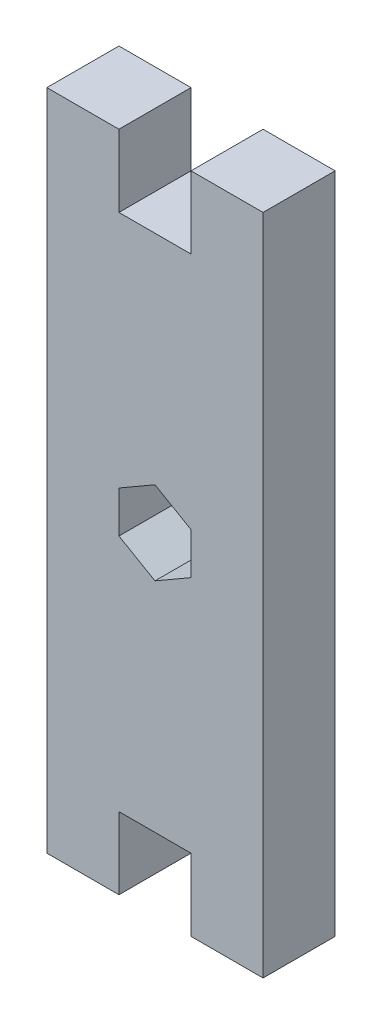
ISO-10303-21;
HEADER;
FILE_DESCRIPTION(('STEP AP214'),'2;1');
FILE_NAME('part.step','',(''),(''),'','','');
FILE_SCHEMA(('AUTOMOTIVE_DESIGN { 1 0 10303 214 1 1 1 1 }'));
ENDSEC;
DATA;
#1=APPLICATION_CONTEXT('core data for automotive mechanical design processes');
#2=APPLICATION_PROTOCOL_DEFINITION('international standard','automotive_design',2000,#1);
#3=PRODUCT_CONTEXT('',#1,'mechanical');
#4=PRODUCT('Part','Part','',(#3));
#5=PRODUCT_RELATED_PRODUCT_CATEGORY('part','',(#4));
#6=PRODUCT_DEFINITION_FORMATION('','',#4);
#7=PRODUCT_DEFINITION_CONTEXT('part definition',#1,'design');
#8=PRODUCT_DEFINITION('design','',#6,#7);
#9=PRODUCT_DEFINITION_SHAPE('','',#8);
#10=(LENGTH_UNIT() NAMED_UNIT(*) SI_UNIT(.MILLI.,.METRE.));
#11=(NAMED_UNIT(*) PLANE_ANGLE_UNIT() SI_UNIT($,.RADIAN.));
#12=(NAMED_UNIT(*) SI_UNIT($,.STERADIAN.) SOLID_ANGLE_UNIT());
#13=UNCERTAINTY_MEASURE_WITH_UNIT(LENGTH_MEASURE(1.E-05),#10,'distance_accuracy_value','');
#14=(GEOMETRIC_REPRESENTATION_CONTEXT(3) GLOBAL_UNCERTAINTY_ASSIGNED_CONTEXT((#13)) GLOBAL_UNIT_ASSIGNED_CONTEXT((#10,
#11,#12)) REPRESENTATION_CONTEXT('',''));
#15=CARTESIAN_POINT('',(0.,0.,0.));
#16=DIRECTION('',(0.,0.,1.));
#17=DIRECTION('',(1.,0.,0.));
#18=AXIS2_PLACEMENT_3D('',#15,#16,#17);
#19=CARTESIAN_POINT('',(-6.53192263334565,2.92543021032505,5.));
#20=DIRECTION('',(1.,0.,0.));
#21=DIRECTION('',(0.,1.,0.));
#22=AXIS2_PLACEMENT_3D('',#19,#20,#21);
#23=PLANE('',#22);
#24=DIRECTION('',(0.,-1.,0.));
#25=VECTOR('',#24,1.);
#26=CARTESIAN_POINT('',(-6.53192263334565,2.92543021032505,0.));
#27=LINE('',#26,#25);
#28=CARTESIAN_POINT('',(-6.53192263334565,2.92543021032505,0.));
#29=VERTEX_POINT('',#28);
#30=CARTESIAN_POINT('',(-6.53192263334564,-43.074569789675,0.));
#31=VERTEX_POINT('',#30);
#32=EDGE_CURVE('E208',#29,#31,#27,.T.);
#33=ORIENTED_EDGE('',*,*,#32,.T.);
#34=DIRECTION('',(0.,0.,-1.));
#35=VECTOR('',#34,1.);
#36=CARTESIAN_POINT('',(-6.53192263334564,-43.074569789675,5.));
#37=LINE('',#36,#35);
#38=CARTESIAN_POINT('',(-6.53192263334564,-43.074569789675,5.));
#39=VERTEX_POINT('',#38);
#40=EDGE_CURVE('E11',#39,#31,#37,.T.);
#41=ORIENTED_EDGE('',*,*,#40,.F.);
#42=DIRECTION('',(0.,-1.,0.));
#43=VECTOR('',#42,1.);
#44=CARTESIAN_POINT('',(-6.53192263334565,2.92543021032505,5.));
#45=LINE('',#44,#43);
#46=CARTESIAN_POINT('',(-6.53192263334565,2.92543021032505,5.));
#47=VERTEX_POINT('',#46);
#48=EDGE_CURVE('E209',#47,#39,#45,.T.);
#49=ORIENTED_EDGE('',*,*,#48,.F.);
#50=DIRECTION('',(0.,0.,-1.));
#51=VECTOR('',#50,1.);
#52=CARTESIAN_POINT('',(-6.53192263334565,2.92543021032505,5.));
#53=LINE('',#52,#51);
#54=EDGE_CURVE('E235',#47,#29,#53,.T.);
#55=ORIENTED_EDGE('',*,*,#54,.T.);
#56=EDGE_LOOP('',(#33,#41,#49,#55));
#57=FACE_BOUND('',#56,.T.);
#58=ADVANCED_FACE('F34',(#57),#23,.F.);
#59=CARTESIAN_POINT('',(-6.53192263334564,-43.074569789675,5.));
#60=DIRECTION('',(0.,1.,0.));
#61=DIRECTION('',(0.,0.,1.));
#62=AXIS2_PLACEMENT_3D('',#59,#60,#61);
#63=PLANE('',#62);
#64=DIRECTION('',(1.,0.,0.));
#65=VECTOR('',#64,1.);
#66=CARTESIAN_POINT('',(-6.53192263334564,-43.074569789675,0.));
#67=LINE('',#66,#65);
#68=CARTESIAN_POINT('',(-1.53192263334564,-43.074569789675,0.));
#69=VERTEX_POINT('',#68);
#70=EDGE_CURVE('E238',#31,#69,#67,.T.);
#71=ORIENTED_EDGE('',*,*,#70,.T.);
#72=DIRECTION('',(0.,0.,-1.));
#73=VECTOR('',#72,1.);
#74=CARTESIAN_POINT('',(-1.53192263334564,-43.074569789675,5.));
#75=LINE('',#74,#73);
#76=CARTESIAN_POINT('',(-1.53192263334564,-43.074569789675,5.));
#77=VERTEX_POINT('',#76);
#78=EDGE_CURVE('E41',#77,#69,#75,.T.);
#79=ORIENTED_EDGE('',*,*,#78,.F.);
#80=DIRECTION('',(1.,0.,0.));
#81=VECTOR('',#80,1.);
#82=CARTESIAN_POINT('',(-6.53192263334564,-43.074569789675,5.));
#83=LINE('',#82,#81);
#84=EDGE_CURVE('E212',#39,#77,#83,.T.);
#85=ORIENTED_EDGE('',*,*,#84,.F.);
#86=ORIENTED_EDGE('',*,*,#40,.T.);
#87=EDGE_LOOP('',(#71,#79,#85,#86));
#88=FACE_BOUND('',#87,.T.);
#89=ADVANCED_FACE('F313',(#88),#63,.F.);
#90=CARTESIAN_POINT('',(-1.53192263334564,-43.074569789675,5.));
#91=DIRECTION('',(-1.,0.,0.));
#92=DIRECTION('',(0.,-1.,0.));
#93=AXIS2_PLACEMENT_3D('',#90,#91,#92);
#94=PLANE('',#93);
#95=DIRECTION('',(0.,1.,0.));
#96=VECTOR('',#95,1.);
#97=CARTESIAN_POINT('',(-1.53192263334564,-43.074569789675,0.));
#98=LINE('',#97,#96);
#99=CARTESIAN_POINT('',(-1.53192263334565,-38.0745697896749,0.));
#100=VERTEX_POINT('',#99);
#101=EDGE_CURVE('E240',#69,#100,#98,.T.);
#102=ORIENTED_EDGE('',*,*,#101,.T.);
#103=DIRECTION('',(0.,0.,-1.));
#104=VECTOR('',#103,1.);
#105=CARTESIAN_POINT('',(-1.53192263334565,-38.0745697896749,5.));
#106=LINE('',#105,#104);
#107=CARTESIAN_POINT('',(-1.53192263334565,-38.0745697896749,5.));
#108=VERTEX_POINT('',#107);
#109=EDGE_CURVE('E285',#108,#100,#106,.T.);
#110=ORIENTED_EDGE('',*,*,#109,.F.);
#111=DIRECTION('',(0.,1.,0.));
#112=VECTOR('',#111,1.);
#113=CARTESIAN_POINT('',(-1.53192263334564,-43.074569789675,5.));
#114=LINE('',#113,#112);
#115=EDGE_CURVE('E215',#77,#108,#114,.T.);
#116=ORIENTED_EDGE('',*,*,#115,.F.);
#117=ORIENTED_EDGE('',*,*,#78,.T.);
#118=EDGE_LOOP('',(#102,#110,#116,#117));
#119=FACE_BOUND('',#118,.T.);
#120=ADVANCED_FACE('F292',(#119),#94,.F.);
#121=CARTESIAN_POINT('',(-1.53192263334565,-38.0745697896749,5.));
#122=DIRECTION('',(0.,1.,0.));
#123=DIRECTION('',(0.,0.,1.));
#124=AXIS2_PLACEMENT_3D('',#121,#122,#123);
#125=PLANE('',#124);
#126=DIRECTION('',(1.,0.,0.));
#127=VECTOR('',#126,1.);
#128=CARTESIAN_POINT('',(-1.53192263334565,-38.0745697896749,0.));
#129=LINE('',#128,#127);
#130=CARTESIAN_POINT('',(3.46807736665436,-38.0745697896749,0.));
#131=VERTEX_POINT('',#130);
#132=EDGE_CURVE('E242',#100,#131,#129,.T.);
#133=ORIENTED_EDGE('',*,*,#132,.T.);
#134=DIRECTION('',(0.,0.,-1.));
#135=VECTOR('',#134,1.);
#136=CARTESIAN_POINT('',(3.46807736665436,-38.0745697896749,5.));
#137=LINE('',#136,#135);
#138=CARTESIAN_POINT('',(3.46807736665436,-38.0745697896749,5.));
#139=VERTEX_POINT('',#138);
#140=EDGE_CURVE('E282',#139,#131,#137,.T.);
#141=ORIENTED_EDGE('',*,*,#140,.F.);
#142=DIRECTION('',(1.,0.,0.));
#143=VECTOR('',#142,1.);
#144=CARTESIAN_POINT('',(-1.53192263334565,-38.0745697896749,5.));
#145=LINE('',#144,#143);
#146=EDGE_CURVE('E217',#108,#139,#145,.T.);
#147=ORIENTED_EDGE('',*,*,#146,.F.);
#148=ORIENTED_EDGE('',*,*,#109,.T.);
#149=EDGE_LOOP('',(#133,#141,#147,#148));
#150=FACE_BOUND('',#149,.T.);
#151=ADVANCED_FACE('F301',(#150),#125,.F.);
#152=CARTESIAN_POINT('',(3.46807736665435,-43.074569789675,5.));
#153=DIRECTION('',(1.,0.,0.));
#154=DIRECTION('',(0.,1.,0.));
#155=AXIS2_PLACEMENT_3D('',#152,#153,#154);
#156=PLANE('',#155);
#157=DIRECTION('',(0.,-1.,0.));
#158=VECTOR('',#157,1.);
#159=CARTESIAN_POINT('',(3.46807736665435,-43.074569789675,0.));
#160=LINE('',#159,#158);
#161=CARTESIAN_POINT('',(3.46807736665435,-43.074569789675,0.));
#162=VERTEX_POINT('',#161);
#163=EDGE_CURVE('E244',#131,#162,#160,.T.);
#164=ORIENTED_EDGE('',*,*,#163,.T.);
#165=DIRECTION('',(0.,0.,-1.));
#166=VECTOR('',#165,1.);
#167=CARTESIAN_POINT('',(3.46807736665435,-43.074569789675,5.));
#168=LINE('',#167,#166);
#169=CARTESIAN_POINT('',(3.46807736665435,-43.074569789675,5.));
#170=VERTEX_POINT('',#169);
#171=EDGE_CURVE('E279',#170,#162,#168,.T.);
#172=ORIENTED_EDGE('',*,*,#171,.F.);
#173=DIRECTION('',(0.,-1.,0.));
#174=VECTOR('',#173,1.);
#175=CARTESIAN_POINT('',(3.46807736665435,-43.074569789675,5.));
#176=LINE('',#175,#174);
#177=EDGE_CURVE('E219',#139,#170,#176,.T.);
#178=ORIENTED_EDGE('',*,*,#177,.F.);
#179=ORIENTED_EDGE('',*,*,#140,.T.);
#180=EDGE_LOOP('',(#164,#172,#178,#179));
#181=FACE_BOUND('',#180,.T.);
#182=ADVANCED_FACE('F305',(#181),#156,.F.);
#183=CARTESIAN_POINT('',(3.46807736665435,-43.074569789675,5.));
#184=DIRECTION('',(0.,1.,0.));
#185=DIRECTION('',(0.,0.,1.));
#186=AXIS2_PLACEMENT_3D('',#183,#184,#185);
#187=PLANE('',#186);
#188=DIRECTION('',(1.,0.,0.));
#189=VECTOR('',#188,1.);
#190=CARTESIAN_POINT('',(3.46807736665435,-43.074569789675,0.));
#191=LINE('',#190,#189);
#192=CARTESIAN_POINT('',(8.46807736665436,-43.074569789675,0.));
#193=VERTEX_POINT('',#192);
#194=EDGE_CURVE('E246',#162,#193,#191,.T.);
#195=ORIENTED_EDGE('',*,*,#194,.T.);
#196=DIRECTION('',(0.,0.,-1.));
#197=VECTOR('',#196,1.);
#198=CARTESIAN_POINT('',(8.46807736665436,-43.074569789675,5.));
#199=LINE('',#198,#197);
#200=CARTESIAN_POINT('',(8.46807736665436,-43.074569789675,5.));
#201=VERTEX_POINT('',#200);
#202=EDGE_CURVE('E276',#201,#193,#199,.T.);
#203=ORIENTED_EDGE('',*,*,#202,.F.);
#204=DIRECTION('',(1.,0.,0.));
#205=VECTOR('',#204,1.);
#206=CARTESIAN_POINT('',(3.46807736665435,-43.074569789675,5.));
#207=LINE('',#206,#205);
#208=EDGE_CURVE('E221',#170,#201,#207,.T.);
#209=ORIENTED_EDGE('',*,*,#208,.F.);
#210=ORIENTED_EDGE('',*,*,#171,.T.);
#211=EDGE_LOOP('',(#195,#203,#209,#210));
#212=FACE_BOUND('',#211,.T.);
#213=ADVANCED_FACE('F346',(#212),#187,.F.);
#214=CARTESIAN_POINT('',(8.46807736665435,2.92543021032505,5.));
#215=DIRECTION('',(-1.,0.,0.));
#216=DIRECTION('',(0.,-1.,0.));
#217=AXIS2_PLACEMENT_3D('',#214,#215,#216);
#218=PLANE('',#217);
#219=DIRECTION('',(0.,1.,0.));
#220=VECTOR('',#219,1.);
#221=CARTESIAN_POINT('',(8.46807736665435,2.92543021032505,0.));
#222=LINE('',#221,#220);
#223=CARTESIAN_POINT('',(8.46807736665435,2.92543021032505,0.));
#224=VERTEX_POINT('',#223);
#225=EDGE_CURVE('E248',#193,#224,#222,.T.);
#226=ORIENTED_EDGE('',*,*,#225,.T.);
#227=DIRECTION('',(0.,0.,-1.));
#228=VECTOR('',#227,1.);
#229=CARTESIAN_POINT('',(8.46807736665435,2.92543021032505,5.));
#230=LINE('',#229,#228);
#231=CARTESIAN_POINT('',(8.46807736665435,2.92543021032505,5.));
#232=VERTEX_POINT('',#231);
#233=EDGE_CURVE('E273',#232,#224,#230,.T.);
#234=ORIENTED_EDGE('',*,*,#233,.F.);
#235=DIRECTION('',(0.,1.,0.));
#236=VECTOR('',#235,1.);
#237=CARTESIAN_POINT('',(8.46807736665435,2.92543021032505,5.));
#238=LINE('',#237,#236);
#239=EDGE_CURVE('E223',#201,#232,#238,.T.);
#240=ORIENTED_EDGE('',*,*,#239,.F.);
#241=ORIENTED_EDGE('',*,*,#202,.T.);
#242=EDGE_LOOP('',(#226,#234,#240,#241));
#243=FACE_BOUND('',#242,.T.);
#244=ADVANCED_FACE('F344',(#243),#218,.F.);
#245=CARTESIAN_POINT('',(3.46807736665435,2.92543021032505,5.));
#246=DIRECTION('',(0.,-1.,0.));
#247=DIRECTION('',(0.,0.,-1.));
#248=AXIS2_PLACEMENT_3D('',#245,#246,#247);
#249=PLANE('',#248);
#250=DIRECTION('',(-1.,0.,0.));
#251=VECTOR('',#250,1.);
#252=CARTESIAN_POINT('',(3.46807736665435,2.92543021032505,0.));
#253=LINE('',#252,#251);
#254=CARTESIAN_POINT('',(3.46807736665435,2.92543021032505,0.));
#255=VERTEX_POINT('',#254);
#256=EDGE_CURVE('E250',#224,#255,#253,.T.);
#257=ORIENTED_EDGE('',*,*,#256,.T.);
#258=DIRECTION('',(0.,0.,-1.));
#259=VECTOR('',#258,1.);
#260=CARTESIAN_POINT('',(3.46807736665435,2.92543021032505,5.));
#261=LINE('',#260,#259);
#262=CARTESIAN_POINT('',(3.46807736665435,2.92543021032505,5.));
#263=VERTEX_POINT('',#262);
#264=EDGE_CURVE('E270',#263,#255,#261,.T.);
#265=ORIENTED_EDGE('',*,*,#264,.F.);
#266=DIRECTION('',(-1.,0.,0.));
#267=VECTOR('',#266,1.);
#268=CARTESIAN_POINT('',(3.46807736665435,2.92543021032505,5.));
#269=LINE('',#268,#267);
#270=EDGE_CURVE('E225',#232,#263,#269,.T.);
#271=ORIENTED_EDGE('',*,*,#270,.F.);
#272=ORIENTED_EDGE('',*,*,#233,.T.);
#273=EDGE_LOOP('',(#257,#265,#271,#272));
#274=FACE_BOUND('',#273,.T.);
#275=ADVANCED_FACE('F340',(#274),#249,.F.);
#276=CARTESIAN_POINT('',(3.46807736665435,2.92543021032505,5.));
#277=DIRECTION('',(1.,0.,0.));
#278=DIRECTION('',(0.,1.,0.));
#279=AXIS2_PLACEMENT_3D('',#276,#277,#278);
#280=PLANE('',#279);
#281=DIRECTION('',(0.,-1.,0.));
#282=VECTOR('',#281,1.);
#283=CARTESIAN_POINT('',(3.46807736665435,2.92543021032505,0.));
#284=LINE('',#283,#282);
#285=CARTESIAN_POINT('',(3.46807736665436,-2.07456978967495,0.));
#286=VERTEX_POINT('',#285);
#287=EDGE_CURVE('E252',#255,#286,#284,.T.);
#288=ORIENTED_EDGE('',*,*,#287,.T.);
#289=DIRECTION('',(0.,0.,-1.));
#290=VECTOR('',#289,1.);
#291=CARTESIAN_POINT('',(3.46807736665436,-2.07456978967495,5.));
#292=LINE('',#291,#290);
#293=CARTESIAN_POINT('',(3.46807736665436,-2.07456978967495,5.));
#294=VERTEX_POINT('',#293);
#295=EDGE_CURVE('E267',#294,#286,#292,.T.);
#296=ORIENTED_EDGE('',*,*,#295,.F.);
#297=DIRECTION('',(0.,-1.,0.));
#298=VECTOR('',#297,1.);
#299=CARTESIAN_POINT('',(3.46807736665435,2.92543021032505,5.));
#300=LINE('',#299,#298);
#301=EDGE_CURVE('E227',#263,#294,#300,.T.);
#302=ORIENTED_EDGE('',*,*,#301,.F.);
#303=ORIENTED_EDGE('',*,*,#264,.T.);
#304=EDGE_LOOP('',(#288,#296,#302,#303));
#305=FACE_BOUND('',#304,.T.);
#306=ADVANCED_FACE('F335',(#305),#280,.F.);
#307=CARTESIAN_POINT('',(-1.53192263334565,-2.07456978967495,5.));
#308=DIRECTION('',(0.,-1.,0.));
#309=DIRECTION('',(1.,0.,0.));
#310=AXIS2_PLACEMENT_3D('',#307,#308,#309);
#311=PLANE('',#310);
#312=DIRECTION('',(-1.,0.,0.));
#313=VECTOR('',#312,1.);
#314=CARTESIAN_POINT('',(-1.53192263334565,-2.07456978967495,0.));
#315=LINE('',#314,#313);
#316=CARTESIAN_POINT('',(-1.53192263334565,-2.07456978967495,0.));
#317=VERTEX_POINT('',#316);
#318=EDGE_CURVE('E254',#286,#317,#315,.T.);
#319=ORIENTED_EDGE('',*,*,#318,.T.);
#320=DIRECTION('',(0.,0.,-1.));
#321=VECTOR('',#320,1.);
#322=CARTESIAN_POINT('',(-1.53192263334565,-2.07456978967495,5.));
#323=LINE('',#322,#321);
#324=CARTESIAN_POINT('',(-1.53192263334565,-2.07456978967495,5.));
#325=VERTEX_POINT('',#324);
#326=EDGE_CURVE('E264',#325,#317,#323,.T.);
#327=ORIENTED_EDGE('',*,*,#326,.F.);
#328=DIRECTION('',(-1.,0.,0.));
#329=VECTOR('',#328,1.);
#330=CARTESIAN_POINT('',(-1.53192263334565,-2.07456978967495,5.));
#331=LINE('',#330,#329);
#332=EDGE_CURVE('E229',#294,#325,#331,.T.);
#333=ORIENTED_EDGE('',*,*,#332,.F.);
#334=ORIENTED_EDGE('',*,*,#295,.T.);
#335=EDGE_LOOP('',(#319,#327,#333,#334));
#336=FACE_BOUND('',#335,.T.);
#337=ADVANCED_FACE('F329',(#336),#311,.F.);
#338=CARTESIAN_POINT('',(-1.53192263334564,2.92543021032505,5.));
#339=DIRECTION('',(-1.,0.,0.));
#340=DIRECTION('',(0.,-1.,0.));
#341=AXIS2_PLACEMENT_3D('',#338,#339,#340);
#342=PLANE('',#341);
#343=DIRECTION('',(0.,1.,0.));
#344=VECTOR('',#343,1.);
#345=CARTESIAN_POINT('',(-1.53192263334564,2.92543021032505,0.));
#346=LINE('',#345,#344);
#347=CARTESIAN_POINT('',(-1.53192263334564,2.92543021032505,0.));
#348=VERTEX_POINT('',#347);
#349=EDGE_CURVE('E256',#317,#348,#346,.T.);
#350=ORIENTED_EDGE('',*,*,#349,.T.);
#351=DIRECTION('',(0.,0.,-1.));
#352=VECTOR('',#351,1.);
#353=CARTESIAN_POINT('',(-1.53192263334564,2.92543021032505,5.));
#354=LINE('',#353,#352);
#355=CARTESIAN_POINT('',(-1.53192263334564,2.92543021032505,5.));
#356=VERTEX_POINT('',#355);
#357=EDGE_CURVE('E261',#356,#348,#354,.T.);
#358=ORIENTED_EDGE('',*,*,#357,.F.);
#359=DIRECTION('',(0.,1.,0.));
#360=VECTOR('',#359,1.);
#361=CARTESIAN_POINT('',(-1.53192263334564,2.92543021032505,5.));
#362=LINE('',#361,#360);
#363=EDGE_CURVE('E231',#325,#356,#362,.T.);
#364=ORIENTED_EDGE('',*,*,#363,.F.);
#365=ORIENTED_EDGE('',*,*,#326,.T.);
#366=EDGE_LOOP('',(#350,#358,#364,#365));
#367=FACE_BOUND('',#366,.T.);
#368=ADVANCED_FACE('F325',(#367),#342,.F.);
#369=CARTESIAN_POINT('',(-6.53192263334565,2.92543021032505,5.));
#370=DIRECTION('',(0.,-1.,0.));
#371=DIRECTION('',(1.,0.,0.));
#372=AXIS2_PLACEMENT_3D('',#369,#370,#371);
#373=PLANE('',#372);
#374=DIRECTION('',(-1.,0.,0.));
#375=VECTOR('',#374,1.);
#376=CARTESIAN_POINT('',(-6.53192263334565,2.92543021032505,0.));
#377=LINE('',#376,#375);
#378=EDGE_CURVE('E213',#348,#29,#377,.T.);
#379=ORIENTED_EDGE('',*,*,#378,.T.);
#380=ORIENTED_EDGE('',*,*,#54,.F.);
#381=DIRECTION('',(-1.,0.,0.));
#382=VECTOR('',#381,1.);
#383=CARTESIAN_POINT('',(-6.53192263334565,2.92543021032505,5.));
#384=LINE('',#383,#382);
#385=EDGE_CURVE('E233',#356,#47,#384,.T.);
#386=ORIENTED_EDGE('',*,*,#385,.F.);
#387=ORIENTED_EDGE('',*,*,#357,.T.);
#388=EDGE_LOOP('',(#379,#380,#386,#387));
#389=FACE_BOUND('',#388,.T.);
#390=ADVANCED_FACE('F320',(#389),#373,.F.);
#391=CARTESIAN_POINT('',(0.,0.,5.));
#392=DIRECTION('',(0.,0.,1.));
#393=DIRECTION('',(1.,0.,0.));
#394=AXIS2_PLACEMENT_3D('',#391,#392,#393);
#395=PLANE('',#394);
#396=DIRECTION('',(0.,1.,0.));
#397=VECTOR('',#396,1.);
#398=CARTESIAN_POINT('',(3.46807736665436,0.,5.));
#399=LINE('',#398,#397);
#400=CARTESIAN_POINT('',(3.46807736665435,-21.517945462649,5.));
#401=VERTEX_POINT('',#400);
#402=CARTESIAN_POINT('',(3.46807736665435,-18.6311941167009,5.));
#403=VERTEX_POINT('',#402);
#404=EDGE_CURVE('E206',#401,#403,#399,.T.);
#405=ORIENTED_EDGE('',*,*,#404,.F.);
#406=DIRECTION('',(0.866025403784439,0.5,0.));
#407=VECTOR('',#406,1.);
#408=CARTESIAN_POINT('',(10.1845630456147,-17.640180647893,5.));
#409=LINE('',#408,#407);
#410=CARTESIAN_POINT('',(0.968077366654351,-22.9613211356231,5.));
#411=VERTEX_POINT('',#410);
#412=EDGE_CURVE('E191',#411,#401,#409,.T.);
#413=ORIENTED_EDGE('',*,*,#412,.F.);
#414=DIRECTION('',(0.866025403784439,-0.5,0.));
#415=VECTOR('',#414,1.);
#416=CARTESIAN_POINT('',(-9.70052436228748,-16.8018010555416,5.));
#417=LINE('',#416,#415);
#418=CARTESIAN_POINT('',(-1.53192263334565,-21.517945462649,5.));
#419=VERTEX_POINT('',#418);
#420=EDGE_CURVE('E164',#419,#411,#417,.T.);
#421=ORIENTED_EDGE('',*,*,#420,.F.);
#422=DIRECTION('',(0.,-1.,0.));
#423=VECTOR('',#422,1.);
#424=CARTESIAN_POINT('',(-1.53192263334565,0.,5.));
#425=LINE('',#424,#423);
#426=CARTESIAN_POINT('',(-1.53192263334565,-18.6311941167009,5.));
#427=VERTEX_POINT('',#426);
#428=EDGE_CURVE('E200',#427,#419,#425,.T.);
#429=ORIENTED_EDGE('',*,*,#428,.F.);
#430=DIRECTION('',(-0.866025403784439,-0.5,0.));
#431=VECTOR('',#430,1.);
#432=CARTESIAN_POINT('',(7.68456304561465,-13.3100536289708,5.));
#433=LINE('',#432,#431);
#434=CARTESIAN_POINT('',(0.968077366654353,-17.1878184437268,5.));
#435=VERTEX_POINT('',#434);
#436=EDGE_CURVE('E202',#435,#427,#433,.T.);
#437=ORIENTED_EDGE('',*,*,#436,.F.);
#438=DIRECTION('',(-0.866025403784439,0.499999999999999,0.));
#439=VECTOR('',#438,1.);
#440=CARTESIAN_POINT('',(-7.20052436228747,-12.4716740366194,5.));
#441=LINE('',#440,#439);
#442=EDGE_CURVE('E204',#403,#435,#441,.T.);
#443=ORIENTED_EDGE('',*,*,#442,.F.);
#444=EDGE_LOOP('',(#405,#413,#421,#429,#437,#443));
#445=FACE_BOUND('',#444,.T.);
#446=ORIENTED_EDGE('',*,*,#48,.T.);
#447=ORIENTED_EDGE('',*,*,#84,.T.);
#448=ORIENTED_EDGE('',*,*,#115,.T.);
#449=ORIENTED_EDGE('',*,*,#146,.T.);
#450=ORIENTED_EDGE('',*,*,#177,.T.);
#451=ORIENTED_EDGE('',*,*,#208,.T.);
#452=ORIENTED_EDGE('',*,*,#239,.T.);
#453=ORIENTED_EDGE('',*,*,#270,.T.);
#454=ORIENTED_EDGE('',*,*,#301,.T.);
#455=ORIENTED_EDGE('',*,*,#332,.T.);
#456=ORIENTED_EDGE('',*,*,#363,.T.);
#457=ORIENTED_EDGE('',*,*,#385,.T.);
#458=EDGE_LOOP('',(#446,#447,#448,#449,#450,#451,#452,#453,#454,#455,#456,#457));
#459=FACE_BOUND('',#458,.T.);
#460=ADVANCED_FACE('F309',(#445,#459),#395,.T.);
#461=CARTESIAN_POINT('',(0.,0.,0.));
#462=DIRECTION('',(0.,0.,1.));
#463=DIRECTION('',(1.,0.,0.));
#464=AXIS2_PLACEMENT_3D('',#461,#462,#463);
#465=PLANE('',#464);
#466=DIRECTION('',(-0.866025403784439,-0.5,0.));
#467=VECTOR('',#466,1.);
#468=CARTESIAN_POINT('',(3.46807736665435,-21.517945462649,0.));
#469=LINE('',#468,#467);
#470=CARTESIAN_POINT('',(3.46807736665435,-21.517945462649,0.));
#471=VERTEX_POINT('',#470);
#472=CARTESIAN_POINT('',(0.968077366654351,-22.9613211356231,0.));
#473=VERTEX_POINT('',#472);
#474=EDGE_CURVE('E170',#471,#473,#469,.T.);
#475=ORIENTED_EDGE('',*,*,#474,.F.);
#476=DIRECTION('',(0.,-1.,0.));
#477=VECTOR('',#476,1.);
#478=CARTESIAN_POINT('',(3.46807736665435,-18.6311941167009,0.));
#479=LINE('',#478,#477);
#480=CARTESIAN_POINT('',(3.46807736665435,-18.6311941167009,0.));
#481=VERTEX_POINT('',#480);
#482=EDGE_CURVE('E56',#481,#471,#479,.T.);
#483=ORIENTED_EDGE('',*,*,#482,.F.);
#484=DIRECTION('',(0.866025403784439,-0.499999999999999,0.));
#485=VECTOR('',#484,1.);
#486=CARTESIAN_POINT('',(0.968077366654353,-17.1878184437268,0.));
#487=LINE('',#486,#485);
#488=CARTESIAN_POINT('',(0.968077366654353,-17.1878184437268,0.));
#489=VERTEX_POINT('',#488);
#490=EDGE_CURVE('E186',#489,#481,#487,.T.);
#491=ORIENTED_EDGE('',*,*,#490,.F.);
#492=DIRECTION('',(0.866025403784439,0.499999999999999,0.));
#493=VECTOR('',#492,1.);
#494=CARTESIAN_POINT('',(-1.53192263334565,-18.6311941167009,0.));
#495=LINE('',#494,#493);
#496=CARTESIAN_POINT('',(-1.53192263334565,-18.6311941167009,0.));
#497=VERTEX_POINT('',#496);
#498=EDGE_CURVE('E180',#497,#489,#495,.T.);
#499=ORIENTED_EDGE('',*,*,#498,.F.);
#500=DIRECTION('',(0.,1.,0.));
#501=VECTOR('',#500,1.);
#502=CARTESIAN_POINT('',(-1.53192263334565,-21.517945462649,0.));
#503=LINE('',#502,#501);
#504=CARTESIAN_POINT('',(-1.53192263334565,-21.517945462649,0.));
#505=VERTEX_POINT('',#504);
#506=EDGE_CURVE('E178',#505,#497,#503,.T.);
#507=ORIENTED_EDGE('',*,*,#506,.F.);
#508=DIRECTION('',(-0.866025403784439,0.5,0.));
#509=VECTOR('',#508,1.);
#510=CARTESIAN_POINT('',(0.968077366654351,-22.9613211356231,0.));
#511=LINE('',#510,#509);
#512=EDGE_CURVE('E161',#473,#505,#511,.T.);
#513=ORIENTED_EDGE('',*,*,#512,.F.);
#514=EDGE_LOOP('',(#475,#483,#491,#499,#507,#513));
#515=FACE_BOUND('',#514,.T.);
#516=ORIENTED_EDGE('',*,*,#32,.F.);
#517=ORIENTED_EDGE('',*,*,#378,.F.);
#518=ORIENTED_EDGE('',*,*,#349,.F.);
#519=ORIENTED_EDGE('',*,*,#318,.F.);
#520=ORIENTED_EDGE('',*,*,#287,.F.);
#521=ORIENTED_EDGE('',*,*,#256,.F.);
#522=ORIENTED_EDGE('',*,*,#225,.F.);
#523=ORIENTED_EDGE('',*,*,#194,.F.);
#524=ORIENTED_EDGE('',*,*,#163,.F.);
#525=ORIENTED_EDGE('',*,*,#132,.F.);
#526=ORIENTED_EDGE('',*,*,#101,.F.);
#527=ORIENTED_EDGE('',*,*,#70,.F.);
#528=EDGE_LOOP('',(#516,#517,#518,#519,#520,#521,#522,#523,#524,#525,#526,#527));
#529=FACE_BOUND('',#528,.T.);
#530=ADVANCED_FACE('F174',(#515,#529),#465,.F.);
#531=CARTESIAN_POINT('',(3.46807736665435,-18.6311941167009,10.));
#532=DIRECTION('',(1.,0.,0.));
#533=DIRECTION('',(0.,1.,0.));
#534=AXIS2_PLACEMENT_3D('',#531,#532,#533);
#535=PLANE('',#534);
#536=ORIENTED_EDGE('',*,*,#404,.T.);
#537=DIRECTION('',(0.,0.,-1.));
#538=VECTOR('',#537,1.);
#539=CARTESIAN_POINT('',(3.46807736665435,-18.6311941167009,10.));
#540=LINE('',#539,#538);
#541=EDGE_CURVE('E189',#403,#481,#540,.T.);
#542=ORIENTED_EDGE('',*,*,#541,.T.);
#543=ORIENTED_EDGE('',*,*,#482,.T.);
#544=DIRECTION('',(0.,0.,-1.));
#545=VECTOR('',#544,1.);
#546=CARTESIAN_POINT('',(3.46807736665435,-21.517945462649,10.));
#547=LINE('',#546,#545);
#548=EDGE_CURVE('E167',#401,#471,#547,.T.);
#549=ORIENTED_EDGE('',*,*,#548,.F.);
#550=EDGE_LOOP('',(#536,#542,#543,#549));
#551=FACE_BOUND('',#550,.T.);
#552=ADVANCED_FACE('F441',(#551),#535,.F.);
#553=CARTESIAN_POINT('',(0.968077366654353,-17.1878184437268,10.));
#554=DIRECTION('',(0.499999999999999,0.866025403784439,0.));
#555=DIRECTION('',(-0.866025403784439,0.499999999999999,0.));
#556=AXIS2_PLACEMENT_3D('',#553,#554,#555);
#557=PLANE('',#556);
#558=ORIENTED_EDGE('',*,*,#442,.T.);
#559=DIRECTION('',(0.,0.,-1.));
#560=VECTOR('',#559,1.);
#561=CARTESIAN_POINT('',(0.968077366654353,-17.1878184437268,10.));
#562=LINE('',#561,#560);
#563=EDGE_CURVE('E192',#435,#489,#562,.T.);
#564=ORIENTED_EDGE('',*,*,#563,.T.);
#565=ORIENTED_EDGE('',*,*,#490,.T.);
#566=ORIENTED_EDGE('',*,*,#541,.F.);
#567=EDGE_LOOP('',(#558,#564,#565,#566));
#568=FACE_BOUND('',#567,.T.);
#569=ADVANCED_FACE('F450',(#568),#557,.F.);
#570=CARTESIAN_POINT('',(-1.53192263334565,-18.6311941167009,10.));
#571=DIRECTION('',(-0.5,0.866025403784439,0.));
#572=DIRECTION('',(-0.866025403784439,-0.5,0.));
#573=AXIS2_PLACEMENT_3D('',#570,#571,#572);
#574=PLANE('',#573);
#575=ORIENTED_EDGE('',*,*,#436,.T.);
#576=DIRECTION('',(0.,0.,-1.));
#577=VECTOR('',#576,1.);
#578=CARTESIAN_POINT('',(-1.53192263334565,-18.6311941167009,10.));
#579=LINE('',#578,#577);
#580=EDGE_CURVE('E194',#427,#497,#579,.T.);
#581=ORIENTED_EDGE('',*,*,#580,.T.);
#582=ORIENTED_EDGE('',*,*,#498,.T.);
#583=ORIENTED_EDGE('',*,*,#563,.F.);
#584=EDGE_LOOP('',(#575,#581,#582,#583));
#585=FACE_BOUND('',#584,.T.);
#586=ADVANCED_FACE('F459',(#585),#574,.F.);
#587=CARTESIAN_POINT('',(-1.53192263334565,-21.517945462649,10.));
#588=DIRECTION('',(-1.,0.,0.));
#589=DIRECTION('',(0.,0.,1.));
#590=AXIS2_PLACEMENT_3D('',#587,#588,#589);
#591=PLANE('',#590);
#592=ORIENTED_EDGE('',*,*,#428,.T.);
#593=DIRECTION('',(0.,0.,-1.));
#594=VECTOR('',#593,1.);
#595=CARTESIAN_POINT('',(-1.53192263334565,-21.517945462649,10.));
#596=LINE('',#595,#594);
#597=EDGE_CURVE('E166',#419,#505,#596,.T.);
#598=ORIENTED_EDGE('',*,*,#597,.T.);
#599=ORIENTED_EDGE('',*,*,#506,.T.);
#600=ORIENTED_EDGE('',*,*,#580,.F.);
#601=EDGE_LOOP('',(#592,#598,#599,#600));
#602=FACE_BOUND('',#601,.T.);
#603=ADVANCED_FACE('F469',(#602),#591,.F.);
#604=CARTESIAN_POINT('',(0.968077366654351,-22.9613211356231,10.));
#605=DIRECTION('',(-0.5,-0.866025403784439,0.));
#606=DIRECTION('',(0.866025403784439,-0.5,0.));
#607=AXIS2_PLACEMENT_3D('',#604,#605,#606);
#608=PLANE('',#607);
#609=ORIENTED_EDGE('',*,*,#420,.T.);
#610=DIRECTION('',(0.,0.,-1.));
#611=VECTOR('',#610,1.);
#612=CARTESIAN_POINT('',(0.968077366654351,-22.9613211356231,10.));
#613=LINE('',#612,#611);
#614=EDGE_CURVE('E48',#411,#473,#613,.T.);
#615=ORIENTED_EDGE('',*,*,#614,.T.);
#616=ORIENTED_EDGE('',*,*,#512,.T.);
#617=ORIENTED_EDGE('',*,*,#597,.F.);
#618=EDGE_LOOP('',(#609,#615,#616,#617));
#619=FACE_BOUND('',#618,.T.);
#620=ADVANCED_FACE('F158',(#619),#608,.F.);
#621=CARTESIAN_POINT('',(3.46807736665435,-21.517945462649,10.));
#622=DIRECTION('',(0.5,-0.866025403784439,0.));
#623=DIRECTION('',(0.866025403784439,0.5,0.));
#624=AXIS2_PLACEMENT_3D('',#621,#622,#623);
#625=PLANE('',#624);
#626=ORIENTED_EDGE('',*,*,#412,.T.);
#627=ORIENTED_EDGE('',*,*,#548,.T.);
#628=ORIENTED_EDGE('',*,*,#474,.T.);
#629=ORIENTED_EDGE('',*,*,#614,.F.);
#630=EDGE_LOOP('',(#626,#627,#628,#629));
#631=FACE_BOUND('',#630,.T.);
#632=ADVANCED_FACE('F171',(#631),#625,.F.);
#633=CLOSED_SHELL('',(#58,#89,#120,#151,#182,#213,#244,#275,#306,#337,#368,#390,#460,#530,#552,
#569,#586,#603,#620,#632));
#634=MANIFOLD_SOLID_BREP('B2',#633);
#635=ADVANCED_BREP_SHAPE_REPRESENTATION('',(#18,#634),#14);
#636=SHAPE_DEFINITION_REPRESENTATION(#9,#635);
ENDSEC;
END-ISO-10303-21;
